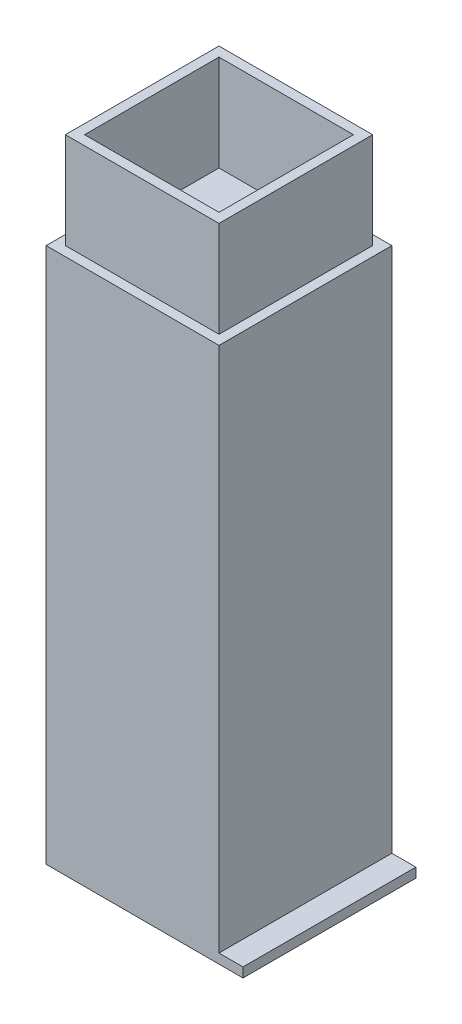
ISO-10303-21;
HEADER;
FILE_DESCRIPTION(('STEP AP214'),'2;1');
FILE_NAME('part.step','',(''),(''),'','','');
FILE_SCHEMA(('AUTOMOTIVE_DESIGN { 1 0 10303 214 1 1 1 1 }'));
ENDSEC;
DATA;
#1=APPLICATION_CONTEXT('core data for automotive mechanical design processes');
#2=APPLICATION_PROTOCOL_DEFINITION('international standard','automotive_design',2000,#1);
#3=PRODUCT_CONTEXT('',#1,'mechanical');
#4=PRODUCT('Part','Part','',(#3));
#5=PRODUCT_RELATED_PRODUCT_CATEGORY('part','',(#4));
#6=PRODUCT_DEFINITION_FORMATION('','',#4);
#7=PRODUCT_DEFINITION_CONTEXT('part definition',#1,'design');
#8=PRODUCT_DEFINITION('design','',#6,#7);
#9=PRODUCT_DEFINITION_SHAPE('','',#8);
#10=(LENGTH_UNIT() NAMED_UNIT(*) SI_UNIT(.MILLI.,.METRE.));
#11=(NAMED_UNIT(*) PLANE_ANGLE_UNIT() SI_UNIT($,.RADIAN.));
#12=(NAMED_UNIT(*) SI_UNIT($,.STERADIAN.) SOLID_ANGLE_UNIT());
#13=UNCERTAINTY_MEASURE_WITH_UNIT(LENGTH_MEASURE(1.E-05),#10,'distance_accuracy_value','');
#14=(GEOMETRIC_REPRESENTATION_CONTEXT(3) GLOBAL_UNCERTAINTY_ASSIGNED_CONTEXT((#13)) GLOBAL_UNIT_ASSIGNED_CONTEXT((#10,
#11,#12)) REPRESENTATION_CONTEXT('',''));
#15=CARTESIAN_POINT('',(0.,0.,0.));
#16=DIRECTION('',(0.,0.,1.));
#17=DIRECTION('',(1.,0.,0.));
#18=AXIS2_PLACEMENT_3D('',#15,#16,#17);
#19=CARTESIAN_POINT('',(0.,81.2,0.));
#20=DIRECTION('',(0.,1.,0.));
#21=DIRECTION('',(0.,0.,1.));
#22=AXIS2_PLACEMENT_3D('',#19,#20,#21);
#23=PLANE('',#22);
#24=DIRECTION('',(0.,0.,1.));
#25=VECTOR('',#24,1.);
#26=CARTESIAN_POINT('',(-79.0444738201403,81.2,-50.0092772389049));
#27=LINE('',#26,#25);
#28=CARTESIAN_POINT('',(-79.0444738201403,81.2,-50.0092772389049));
#29=VERTEX_POINT('',#28);
#30=CARTESIAN_POINT('',(-79.0444738201403,81.2,-14.0092772389049));
#31=VERTEX_POINT('',#30);
#32=EDGE_CURVE('E221',#29,#31,#27,.T.);
#33=ORIENTED_EDGE('',*,*,#32,.T.);
#34=DIRECTION('',(1.,0.,0.));
#35=VECTOR('',#34,1.);
#36=CARTESIAN_POINT('',(-79.0444738201403,81.2,-14.0092772389049));
#37=LINE('',#36,#35);
#38=CARTESIAN_POINT('',(-43.0444738201402,81.2,-14.0092772389049));
#39=VERTEX_POINT('',#38);
#40=EDGE_CURVE('E224',#31,#39,#37,.T.);
#41=ORIENTED_EDGE('',*,*,#40,.T.);
#42=DIRECTION('',(0.,0.,-1.));
#43=VECTOR('',#42,1.);
#44=CARTESIAN_POINT('',(-43.0444738201402,81.2,-50.0092772389049));
#45=LINE('',#44,#43);
#46=CARTESIAN_POINT('',(-43.0444738201402,81.2,-50.0092772389049));
#47=VERTEX_POINT('',#46);
#48=EDGE_CURVE('E228',#39,#47,#45,.T.);
#49=ORIENTED_EDGE('',*,*,#48,.T.);
#50=DIRECTION('',(-1.,0.,0.));
#51=VECTOR('',#50,1.);
#52=CARTESIAN_POINT('',(-79.0444738201403,81.2,-50.0092772389049));
#53=LINE('',#52,#51);
#54=EDGE_CURVE('E231',#47,#29,#53,.T.);
#55=ORIENTED_EDGE('',*,*,#54,.T.);
#56=EDGE_LOOP('',(#33,#41,#49,#55));
#57=FACE_BOUND('',#56,.T.);
#58=DIRECTION('',(0.,0.,-1.));
#59=VECTOR('',#58,1.);
#60=CARTESIAN_POINT('',(-45.0444738201402,81.2,0.));
#61=LINE('',#60,#59);
#62=CARTESIAN_POINT('',(-45.0444738201402,81.2,-16.0092772389049));
#63=VERTEX_POINT('',#62);
#64=CARTESIAN_POINT('',(-45.0444738201402,81.2,-48.0092772389049));
#65=VERTEX_POINT('',#64);
#66=EDGE_CURVE('E56',#63,#65,#61,.T.);
#67=ORIENTED_EDGE('',*,*,#66,.F.);
#68=DIRECTION('',(1.,0.,0.));
#69=VECTOR('',#68,1.);
#70=CARTESIAN_POINT('',(0.,81.2,-16.0092772389049));
#71=LINE('',#70,#69);
#72=CARTESIAN_POINT('',(-77.0444738201403,81.2,-16.0092772389049));
#73=VERTEX_POINT('',#72);
#74=EDGE_CURVE('E211',#73,#63,#71,.T.);
#75=ORIENTED_EDGE('',*,*,#74,.F.);
#76=DIRECTION('',(0.,0.,-1.));
#77=VECTOR('',#76,1.);
#78=CARTESIAN_POINT('',(-77.0444738201403,81.2,0.));
#79=LINE('',#78,#77);
#80=CARTESIAN_POINT('',(-77.0444738201403,81.2,-48.0092772389049));
#81=VERTEX_POINT('',#80);
#82=EDGE_CURVE('E397',#73,#81,#79,.T.);
#83=ORIENTED_EDGE('',*,*,#82,.T.);
#84=DIRECTION('',(1.,0.,0.));
#85=VECTOR('',#84,1.);
#86=CARTESIAN_POINT('',(0.,81.2,-48.0092772389049));
#87=LINE('',#86,#85);
#88=EDGE_CURVE('E61',#81,#65,#87,.T.);
#89=ORIENTED_EDGE('',*,*,#88,.T.);
#90=EDGE_LOOP('',(#67,#75,#83,#89));
#91=FACE_BOUND('',#90,.T.);
#92=ADVANCED_FACE('F40',(#57,#91),#23,.T.);
#93=CARTESIAN_POINT('',(-43.0444738201403,76.2,-50.0092772389049));
#94=DIRECTION('',(-1.,0.,0.));
#95=DIRECTION('',(0.,0.,1.));
#96=AXIS2_PLACEMENT_3D('',#93,#94,#95);
#97=PLANE('',#96);
#98=DIRECTION('',(0.,0.,1.));
#99=VECTOR('',#98,1.);
#100=CARTESIAN_POINT('',(-43.0444738201402,-28.4,-14.0092772389049));
#101=LINE('',#100,#99);
#102=CARTESIAN_POINT('',(-43.0444738201403,-28.4,-50.0092772389049));
#103=VERTEX_POINT('',#102);
#104=CARTESIAN_POINT('',(-43.0444738201402,-28.4,-14.0092772389049));
#105=VERTEX_POINT('',#104);
#106=EDGE_CURVE('E234',#103,#105,#101,.T.);
#107=ORIENTED_EDGE('',*,*,#106,.F.);
#108=DIRECTION('',(0.,-1.,0.));
#109=VECTOR('',#108,1.);
#110=CARTESIAN_POINT('',(-43.0444738201403,76.2,-50.0092772389049));
#111=LINE('',#110,#109);
#112=EDGE_CURVE('E326',#47,#103,#111,.T.);
#113=ORIENTED_EDGE('',*,*,#112,.F.);
#114=ORIENTED_EDGE('',*,*,#48,.F.);
#115=DIRECTION('',(0.,-1.,0.));
#116=VECTOR('',#115,1.);
#117=CARTESIAN_POINT('',(-43.0444738201402,76.2,-14.0092772389049));
#118=LINE('',#117,#116);
#119=EDGE_CURVE('E49',#39,#105,#118,.T.);
#120=ORIENTED_EDGE('',*,*,#119,.T.);
#121=EDGE_LOOP('',(#107,#113,#114,#120));
#122=FACE_BOUND('',#121,.T.);
#123=ADVANCED_FACE('F330',(#122),#97,.F.);
#124=CARTESIAN_POINT('',(-79.0444738201403,76.2,-50.0092772389049));
#125=DIRECTION('',(1.,0.,0.));
#126=DIRECTION('',(0.,0.,-1.));
#127=AXIS2_PLACEMENT_3D('',#124,#125,#126);
#128=PLANE('',#127);
#129=DIRECTION('',(0.,-1.,0.));
#130=VECTOR('',#129,1.);
#131=CARTESIAN_POINT('',(-79.0444738201403,76.2,-50.0092772389049));
#132=LINE('',#131,#130);
#133=CARTESIAN_POINT('',(-79.0444738201403,-30.4,-50.0092772389049));
#134=VERTEX_POINT('',#133);
#135=EDGE_CURVE('E324',#29,#134,#132,.T.);
#136=ORIENTED_EDGE('',*,*,#135,.T.);
#137=DIRECTION('',(0.,0.,-1.));
#138=VECTOR('',#137,1.);
#139=CARTESIAN_POINT('',(-79.0444738201403,-30.4,-14.0092772389049));
#140=LINE('',#139,#138);
#141=CARTESIAN_POINT('',(-79.0444738201403,-30.4,-14.0092772389049));
#142=VERTEX_POINT('',#141);
#143=EDGE_CURVE('E286',#142,#134,#140,.T.);
#144=ORIENTED_EDGE('',*,*,#143,.F.);
#145=DIRECTION('',(0.,-1.,0.));
#146=VECTOR('',#145,1.);
#147=CARTESIAN_POINT('',(-79.0444738201403,76.2,-14.0092772389049));
#148=LINE('',#147,#146);
#149=EDGE_CURVE('E11',#31,#142,#148,.T.);
#150=ORIENTED_EDGE('',*,*,#149,.F.);
#151=ORIENTED_EDGE('',*,*,#32,.F.);
#152=EDGE_LOOP('',(#136,#144,#150,#151));
#153=FACE_BOUND('',#152,.T.);
#154=ADVANCED_FACE('F42',(#153),#128,.F.);
#155=CARTESIAN_POINT('',(-79.0444738201403,76.2,-14.0092772389049));
#156=DIRECTION('',(0.,0.,-1.));
#157=DIRECTION('',(-1.,0.,0.));
#158=AXIS2_PLACEMENT_3D('',#155,#156,#157);
#159=PLANE('',#158);
#160=ORIENTED_EDGE('',*,*,#149,.T.);
#161=DIRECTION('',(-1.,0.,0.));
#162=VECTOR('',#161,1.);
#163=CARTESIAN_POINT('',(-43.0444738201402,-30.4,-14.0092772389049));
#164=LINE('',#163,#162);
#165=CARTESIAN_POINT('',(-38.0444738201402,-30.4,-14.0092772389049));
#166=VERTEX_POINT('',#165);
#167=EDGE_CURVE('E283',#166,#142,#164,.T.);
#168=ORIENTED_EDGE('',*,*,#167,.F.);
#169=DIRECTION('',(0.,-1.,0.));
#170=VECTOR('',#169,1.);
#171=CARTESIAN_POINT('',(-38.0444738201402,-28.4,-14.0092772389049));
#172=LINE('',#171,#170);
#173=CARTESIAN_POINT('',(-38.0444738201402,-28.4,-14.0092772389049));
#174=VERTEX_POINT('',#173);
#175=EDGE_CURVE('E235',#174,#166,#172,.T.);
#176=ORIENTED_EDGE('',*,*,#175,.F.);
#177=DIRECTION('',(-1.,0.,0.));
#178=VECTOR('',#177,1.);
#179=CARTESIAN_POINT('',(-38.0444738201402,-28.4,-14.0092772389049));
#180=LINE('',#179,#178);
#181=EDGE_CURVE('E245',#174,#105,#180,.T.);
#182=ORIENTED_EDGE('',*,*,#181,.T.);
#183=ORIENTED_EDGE('',*,*,#119,.F.);
#184=ORIENTED_EDGE('',*,*,#40,.F.);
#185=EDGE_LOOP('',(#160,#168,#176,#182,#183,#184));
#186=FACE_BOUND('',#185,.T.);
#187=ADVANCED_FACE('F339',(#186),#159,.F.);
#188=CARTESIAN_POINT('',(-79.0444738201403,76.2,-50.0092772389049));
#189=DIRECTION('',(0.,0.,1.));
#190=DIRECTION('',(1.,0.,0.));
#191=AXIS2_PLACEMENT_3D('',#188,#189,#190);
#192=PLANE('',#191);
#193=ORIENTED_EDGE('',*,*,#112,.T.);
#194=DIRECTION('',(-1.,0.,0.));
#195=VECTOR('',#194,1.);
#196=CARTESIAN_POINT('',(-38.0444738201403,-28.4,-50.0092772389049));
#197=LINE('',#196,#195);
#198=CARTESIAN_POINT('',(-38.0444738201403,-28.4,-50.0092772389049));
#199=VERTEX_POINT('',#198);
#200=EDGE_CURVE('E250',#199,#103,#197,.T.);
#201=ORIENTED_EDGE('',*,*,#200,.F.);
#202=DIRECTION('',(0.,1.,0.));
#203=VECTOR('',#202,1.);
#204=CARTESIAN_POINT('',(-38.0444738201403,-28.4,-50.0092772389049));
#205=LINE('',#204,#203);
#206=CARTESIAN_POINT('',(-38.0444738201403,-30.4,-50.0092772389049));
#207=VERTEX_POINT('',#206);
#208=EDGE_CURVE('E241',#207,#199,#205,.T.);
#209=ORIENTED_EDGE('',*,*,#208,.F.);
#210=DIRECTION('',(1.,0.,0.));
#211=VECTOR('',#210,1.);
#212=CARTESIAN_POINT('',(-43.0444738201402,-30.4,-50.0092772389049));
#213=LINE('',#212,#211);
#214=EDGE_CURVE('E289',#134,#207,#213,.T.);
#215=ORIENTED_EDGE('',*,*,#214,.F.);
#216=ORIENTED_EDGE('',*,*,#135,.F.);
#217=ORIENTED_EDGE('',*,*,#54,.F.);
#218=EDGE_LOOP('',(#193,#201,#209,#215,#216,#217));
#219=FACE_BOUND('',#218,.T.);
#220=ADVANCED_FACE('F346',(#219),#192,.F.);
#221=CARTESIAN_POINT('',(0.,-30.4,0.));
#222=DIRECTION('',(0.,1.,0.));
#223=DIRECTION('',(0.,0.,1.));
#224=AXIS2_PLACEMENT_3D('',#221,#222,#223);
#225=PLANE('',#224);
#226=ORIENTED_EDGE('',*,*,#214,.T.);
#227=DIRECTION('',(0.,0.,-1.));
#228=VECTOR('',#227,1.);
#229=CARTESIAN_POINT('',(-38.0444738201402,-30.4,-14.0092772389049));
#230=LINE('',#229,#228);
#231=EDGE_CURVE('E238',#166,#207,#230,.T.);
#232=ORIENTED_EDGE('',*,*,#231,.F.);
#233=ORIENTED_EDGE('',*,*,#167,.T.);
#234=ORIENTED_EDGE('',*,*,#143,.T.);
#235=EDGE_LOOP('',(#226,#232,#233,#234));
#236=FACE_BOUND('',#235,.T.);
#237=DIRECTION('',(0.,0.,-1.));
#238=VECTOR('',#237,1.);
#239=CARTESIAN_POINT('',(-77.0444738201403,-30.4,-16.0092772389049));
#240=LINE('',#239,#238);
#241=CARTESIAN_POINT('',(-77.0444738201403,-30.4,-16.0092772389049));
#242=VERTEX_POINT('',#241);
#243=CARTESIAN_POINT('',(-77.0444738201403,-30.4,-48.0092772389049));
#244=VERTEX_POINT('',#243);
#245=EDGE_CURVE('E254',#242,#244,#240,.T.);
#246=ORIENTED_EDGE('',*,*,#245,.F.);
#247=DIRECTION('',(-1.,0.,0.));
#248=VECTOR('',#247,1.);
#249=CARTESIAN_POINT('',(-77.0444738201403,-30.4,-16.0092772389049));
#250=LINE('',#249,#248);
#251=CARTESIAN_POINT('',(-45.0444738201402,-30.4,-16.0092772389049));
#252=VERTEX_POINT('',#251);
#253=EDGE_CURVE('E262',#252,#242,#250,.T.);
#254=ORIENTED_EDGE('',*,*,#253,.F.);
#255=DIRECTION('',(0.,0.,1.));
#256=VECTOR('',#255,1.);
#257=CARTESIAN_POINT('',(-45.0444738201402,-30.4,-16.0092772389049));
#258=LINE('',#257,#256);
#259=CARTESIAN_POINT('',(-45.0444738201402,-30.4,-48.0092772389049));
#260=VERTEX_POINT('',#259);
#261=EDGE_CURVE('E259',#260,#252,#258,.T.);
#262=ORIENTED_EDGE('',*,*,#261,.F.);
#263=DIRECTION('',(1.,0.,0.));
#264=VECTOR('',#263,1.);
#265=CARTESIAN_POINT('',(-77.0444738201403,-30.4,-48.0092772389049));
#266=LINE('',#265,#264);
#267=EDGE_CURVE('E256',#244,#260,#266,.T.);
#268=ORIENTED_EDGE('',*,*,#267,.F.);
#269=EDGE_LOOP('',(#246,#254,#262,#268));
#270=FACE_BOUND('',#269,.T.);
#271=ADVANCED_FACE('F353',(#236,#270),#225,.F.);
#272=CARTESIAN_POINT('',(-77.0444738201403,-30.4,-16.0092772389049));
#273=DIRECTION('',(1.,0.,0.));
#274=DIRECTION('',(0.,0.,-1.));
#275=AXIS2_PLACEMENT_3D('',#272,#273,#274);
#276=PLANE('',#275);
#277=DIRECTION('',(0.,0.,-1.));
#278=VECTOR('',#277,1.);
#279=CARTESIAN_POINT('',(-77.0444738201403,-5.,-16.0092772389049));
#280=LINE('',#279,#278);
#281=CARTESIAN_POINT('',(-77.0444738201403,-5.,-16.0092772389049));
#282=VERTEX_POINT('',#281);
#283=CARTESIAN_POINT('',(-77.0444738201403,-5.,-48.0092772389049));
#284=VERTEX_POINT('',#283);
#285=EDGE_CURVE('E253',#282,#284,#280,.T.);
#286=ORIENTED_EDGE('',*,*,#285,.F.);
#287=DIRECTION('',(0.,1.,0.));
#288=VECTOR('',#287,1.);
#289=CARTESIAN_POINT('',(-77.0444738201403,-30.4,-16.0092772389049));
#290=LINE('',#289,#288);
#291=EDGE_CURVE('E264',#242,#282,#290,.T.);
#292=ORIENTED_EDGE('',*,*,#291,.F.);
#293=ORIENTED_EDGE('',*,*,#245,.T.);
#294=DIRECTION('',(0.,1.,0.));
#295=VECTOR('',#294,1.);
#296=CARTESIAN_POINT('',(-77.0444738201403,-30.4,-48.0092772389049));
#297=LINE('',#296,#295);
#298=EDGE_CURVE('E280',#244,#284,#297,.T.);
#299=ORIENTED_EDGE('',*,*,#298,.T.);
#300=EDGE_LOOP('',(#286,#292,#293,#299));
#301=FACE_BOUND('',#300,.T.);
#302=ADVANCED_FACE('F558',(#301),#276,.T.);
#303=CARTESIAN_POINT('',(-77.0444738201403,-30.4,-48.0092772389049));
#304=DIRECTION('',(0.,0.,1.));
#305=DIRECTION('',(1.,0.,0.));
#306=AXIS2_PLACEMENT_3D('',#303,#304,#305);
#307=PLANE('',#306);
#308=DIRECTION('',(1.,0.,0.));
#309=VECTOR('',#308,1.);
#310=CARTESIAN_POINT('',(-77.0444738201403,-5.,-48.0092772389049));
#311=LINE('',#310,#309);
#312=CARTESIAN_POINT('',(-45.0444738201402,-5.,-48.0092772389049));
#313=VERTEX_POINT('',#312);
#314=EDGE_CURVE('E267',#284,#313,#311,.T.);
#315=ORIENTED_EDGE('',*,*,#314,.F.);
#316=ORIENTED_EDGE('',*,*,#298,.F.);
#317=ORIENTED_EDGE('',*,*,#267,.T.);
#318=DIRECTION('',(0.,1.,0.));
#319=VECTOR('',#318,1.);
#320=CARTESIAN_POINT('',(-45.0444738201402,-30.4,-48.0092772389049));
#321=LINE('',#320,#319);
#322=EDGE_CURVE('E278',#260,#313,#321,.T.);
#323=ORIENTED_EDGE('',*,*,#322,.T.);
#324=EDGE_LOOP('',(#315,#316,#317,#323));
#325=FACE_BOUND('',#324,.T.);
#326=ADVANCED_FACE('F550',(#325),#307,.T.);
#327=CARTESIAN_POINT('',(-45.0444738201402,-30.4,-16.0092772389049));
#328=DIRECTION('',(-1.,0.,0.));
#329=DIRECTION('',(0.,0.,1.));
#330=AXIS2_PLACEMENT_3D('',#327,#328,#329);
#331=PLANE('',#330);
#332=DIRECTION('',(0.,0.,1.));
#333=VECTOR('',#332,1.);
#334=CARTESIAN_POINT('',(-45.0444738201402,-5.,-16.0092772389049));
#335=LINE('',#334,#333);
#336=CARTESIAN_POINT('',(-45.0444738201402,-5.,-16.0092772389049));
#337=VERTEX_POINT('',#336);
#338=EDGE_CURVE('E270',#313,#337,#335,.T.);
#339=ORIENTED_EDGE('',*,*,#338,.F.);
#340=ORIENTED_EDGE('',*,*,#322,.F.);
#341=ORIENTED_EDGE('',*,*,#261,.T.);
#342=DIRECTION('',(0.,1.,0.));
#343=VECTOR('',#342,1.);
#344=CARTESIAN_POINT('',(-45.0444738201402,-30.4,-16.0092772389049));
#345=LINE('',#344,#343);
#346=EDGE_CURVE('E276',#252,#337,#345,.T.);
#347=ORIENTED_EDGE('',*,*,#346,.T.);
#348=EDGE_LOOP('',(#339,#340,#341,#347));
#349=FACE_BOUND('',#348,.T.);
#350=ADVANCED_FACE('F542',(#349),#331,.T.);
#351=CARTESIAN_POINT('',(-77.0444738201403,-30.4,-16.0092772389049));
#352=DIRECTION('',(0.,0.,-1.));
#353=DIRECTION('',(-1.,0.,0.));
#354=AXIS2_PLACEMENT_3D('',#351,#352,#353);
#355=PLANE('',#354);
#356=DIRECTION('',(-1.,0.,0.));
#357=VECTOR('',#356,1.);
#358=CARTESIAN_POINT('',(-77.0444738201403,-5.,-16.0092772389049));
#359=LINE('',#358,#357);
#360=EDGE_CURVE('E257',#337,#282,#359,.T.);
#361=ORIENTED_EDGE('',*,*,#360,.F.);
#362=ORIENTED_EDGE('',*,*,#346,.F.);
#363=ORIENTED_EDGE('',*,*,#253,.T.);
#364=ORIENTED_EDGE('',*,*,#291,.T.);
#365=EDGE_LOOP('',(#361,#362,#363,#364));
#366=FACE_BOUND('',#365,.T.);
#367=ADVANCED_FACE('F534',(#366),#355,.T.);
#368=CARTESIAN_POINT('',(0.,-5.,0.));
#369=DIRECTION('',(0.,1.,0.));
#370=DIRECTION('',(0.,0.,1.));
#371=AXIS2_PLACEMENT_3D('',#368,#369,#370);
#372=PLANE('',#371);
#373=ORIENTED_EDGE('',*,*,#360,.T.);
#374=ORIENTED_EDGE('',*,*,#285,.T.);
#375=ORIENTED_EDGE('',*,*,#314,.T.);
#376=ORIENTED_EDGE('',*,*,#338,.T.);
#377=EDGE_LOOP('',(#373,#374,#375,#376));
#378=FACE_BOUND('',#377,.T.);
#379=ADVANCED_FACE('F526',(#378),#372,.F.);
#380=CARTESIAN_POINT('',(-38.0444738201402,-28.4,-14.0092772389049));
#381=DIRECTION('',(0.,-1.,0.));
#382=DIRECTION('',(0.,0.,-1.));
#383=AXIS2_PLACEMENT_3D('',#380,#381,#382);
#384=PLANE('',#383);
#385=ORIENTED_EDGE('',*,*,#106,.T.);
#386=ORIENTED_EDGE('',*,*,#181,.F.);
#387=DIRECTION('',(0.,0.,1.));
#388=VECTOR('',#387,1.);
#389=CARTESIAN_POINT('',(-38.0444738201402,-28.4,-14.0092772389049));
#390=LINE('',#389,#388);
#391=EDGE_CURVE('E243',#199,#174,#390,.T.);
#392=ORIENTED_EDGE('',*,*,#391,.F.);
#393=ORIENTED_EDGE('',*,*,#200,.T.);
#394=EDGE_LOOP('',(#385,#386,#392,#393));
#395=FACE_BOUND('',#394,.T.);
#396=ADVANCED_FACE('F335',(#395),#384,.F.);
#397=CARTESIAN_POINT('',(-38.0444738201402,0.,0.));
#398=DIRECTION('',(1.,0.,0.));
#399=DIRECTION('',(0.,0.,-1.));
#400=AXIS2_PLACEMENT_3D('',#397,#398,#399);
#401=PLANE('',#400);
#402=ORIENTED_EDGE('',*,*,#175,.T.);
#403=ORIENTED_EDGE('',*,*,#231,.T.);
#404=ORIENTED_EDGE('',*,*,#208,.T.);
#405=ORIENTED_EDGE('',*,*,#391,.T.);
#406=EDGE_LOOP('',(#402,#403,#404,#405));
#407=FACE_BOUND('',#406,.T.);
#408=ADVANCED_FACE('F342',(#407),#401,.T.);
#409=CARTESIAN_POINT('',(0.,101.2,-46.0092772389049));
#410=DIRECTION('',(0.,0.,-1.));
#411=DIRECTION('',(-1.,0.,0.));
#412=AXIS2_PLACEMENT_3D('',#409,#410,#411);
#413=PLANE('',#412);
#414=DIRECTION('',(1.,0.,0.));
#415=VECTOR('',#414,1.);
#416=CARTESIAN_POINT('',(0.,81.2,-46.0092772389049));
#417=LINE('',#416,#415);
#418=CARTESIAN_POINT('',(-75.0444738201403,81.2,-46.0092772389049));
#419=VERTEX_POINT('',#418);
#420=CARTESIAN_POINT('',(-47.0444738201402,81.2,-46.0092772389049));
#421=VERTEX_POINT('',#420);
#422=EDGE_CURVE('E380',#419,#421,#417,.T.);
#423=ORIENTED_EDGE('',*,*,#422,.T.);
#424=DIRECTION('',(0.,-1.,0.));
#425=VECTOR('',#424,1.);
#426=CARTESIAN_POINT('',(-47.0444738201402,101.2,-46.0092772389049));
#427=LINE('',#426,#425);
#428=CARTESIAN_POINT('',(-47.0444738201402,101.2,-46.0092772389049));
#429=VERTEX_POINT('',#428);
#430=EDGE_CURVE('E225',#429,#421,#427,.T.);
#431=ORIENTED_EDGE('',*,*,#430,.F.);
#432=DIRECTION('',(1.,0.,0.));
#433=VECTOR('',#432,1.);
#434=CARTESIAN_POINT('',(0.,101.2,-46.0092772389049));
#435=LINE('',#434,#433);
#436=CARTESIAN_POINT('',(-75.0444738201403,101.2,-46.0092772389049));
#437=VERTEX_POINT('',#436);
#438=EDGE_CURVE('E424',#437,#429,#435,.T.);
#439=ORIENTED_EDGE('',*,*,#438,.F.);
#440=DIRECTION('',(0.,-1.,0.));
#441=VECTOR('',#440,1.);
#442=CARTESIAN_POINT('',(-75.0444738201403,101.2,-46.0092772389049));
#443=LINE('',#442,#441);
#444=EDGE_CURVE('E212',#437,#419,#443,.T.);
#445=ORIENTED_EDGE('',*,*,#444,.T.);
#446=EDGE_LOOP('',(#423,#431,#439,#445));
#447=FACE_BOUND('',#446,.T.);
#448=ADVANCED_FACE('F395',(#447),#413,.F.);
#449=CARTESIAN_POINT('',(-47.0444738201402,101.2,0.));
#450=DIRECTION('',(1.,0.,0.));
#451=DIRECTION('',(0.,0.,-1.));
#452=AXIS2_PLACEMENT_3D('',#449,#450,#451);
#453=PLANE('',#452);
#454=DIRECTION('',(0.,0.,1.));
#455=VECTOR('',#454,1.);
#456=CARTESIAN_POINT('',(-47.0444738201402,81.2,0.));
#457=LINE('',#456,#455);
#458=CARTESIAN_POINT('',(-47.0444738201402,81.2,-18.0092772389049));
#459=VERTEX_POINT('',#458);
#460=EDGE_CURVE('E377',#421,#459,#457,.T.);
#461=ORIENTED_EDGE('',*,*,#460,.T.);
#462=DIRECTION('',(0.,-1.,0.));
#463=VECTOR('',#462,1.);
#464=CARTESIAN_POINT('',(-47.0444738201402,101.2,-18.0092772389049));
#465=LINE('',#464,#463);
#466=CARTESIAN_POINT('',(-47.0444738201402,101.2,-18.0092772389049));
#467=VERTEX_POINT('',#466);
#468=EDGE_CURVE('E393',#467,#459,#465,.T.);
#469=ORIENTED_EDGE('',*,*,#468,.F.);
#470=DIRECTION('',(0.,0.,1.));
#471=VECTOR('',#470,1.);
#472=CARTESIAN_POINT('',(-47.0444738201402,101.2,0.));
#473=LINE('',#472,#471);
#474=EDGE_CURVE('E389',#429,#467,#473,.T.);
#475=ORIENTED_EDGE('',*,*,#474,.F.);
#476=ORIENTED_EDGE('',*,*,#430,.T.);
#477=EDGE_LOOP('',(#461,#469,#475,#476));
#478=FACE_BOUND('',#477,.T.);
#479=ADVANCED_FACE('F388',(#478),#453,.F.);
#480=CARTESIAN_POINT('',(0.,101.2,-18.0092772389049));
#481=DIRECTION('',(0.,0.,-1.));
#482=DIRECTION('',(-1.,0.,0.));
#483=AXIS2_PLACEMENT_3D('',#480,#481,#482);
#484=PLANE('',#483);
#485=DIRECTION('',(1.,0.,0.));
#486=VECTOR('',#485,1.);
#487=CARTESIAN_POINT('',(0.,81.2,-18.0092772389049));
#488=LINE('',#487,#486);
#489=CARTESIAN_POINT('',(-75.0444738201403,81.2,-18.0092772389049));
#490=VERTEX_POINT('',#489);
#491=EDGE_CURVE('E382',#490,#459,#488,.T.);
#492=ORIENTED_EDGE('',*,*,#491,.F.);
#493=DIRECTION('',(0.,-1.,0.));
#494=VECTOR('',#493,1.);
#495=CARTESIAN_POINT('',(-75.0444738201403,101.2,-18.0092772389049));
#496=LINE('',#495,#494);
#497=CARTESIAN_POINT('',(-75.0444738201403,101.2,-18.0092772389049));
#498=VERTEX_POINT('',#497);
#499=EDGE_CURVE('E215',#498,#490,#496,.T.);
#500=ORIENTED_EDGE('',*,*,#499,.F.);
#501=DIRECTION('',(1.,0.,0.));
#502=VECTOR('',#501,1.);
#503=CARTESIAN_POINT('',(0.,101.2,-18.0092772389049));
#504=LINE('',#503,#502);
#505=EDGE_CURVE('E420',#498,#467,#504,.T.);
#506=ORIENTED_EDGE('',*,*,#505,.T.);
#507=ORIENTED_EDGE('',*,*,#468,.T.);
#508=EDGE_LOOP('',(#492,#500,#506,#507));
#509=FACE_BOUND('',#508,.T.);
#510=ADVANCED_FACE('F431',(#509),#484,.T.);
#511=CARTESIAN_POINT('',(0.,101.2,-16.0092772389049));
#512=DIRECTION('',(0.,0.,-1.));
#513=DIRECTION('',(-1.,0.,0.));
#514=AXIS2_PLACEMENT_3D('',#511,#512,#513);
#515=PLANE('',#514);
#516=ORIENTED_EDGE('',*,*,#74,.T.);
#517=DIRECTION('',(0.,-1.,0.));
#518=VECTOR('',#517,1.);
#519=CARTESIAN_POINT('',(-45.0444738201402,101.2,-16.0092772389049));
#520=LINE('',#519,#518);
#521=CARTESIAN_POINT('',(-45.0444738201402,101.2,-16.0092772389049));
#522=VERTEX_POINT('',#521);
#523=EDGE_CURVE('E191',#522,#63,#520,.T.);
#524=ORIENTED_EDGE('',*,*,#523,.F.);
#525=DIRECTION('',(1.,0.,0.));
#526=VECTOR('',#525,1.);
#527=CARTESIAN_POINT('',(0.,101.2,-16.0092772389049));
#528=LINE('',#527,#526);
#529=CARTESIAN_POINT('',(-77.0444738201403,101.2,-16.0092772389049));
#530=VERTEX_POINT('',#529);
#531=EDGE_CURVE('E198',#530,#522,#528,.T.);
#532=ORIENTED_EDGE('',*,*,#531,.F.);
#533=DIRECTION('',(0.,-1.,0.));
#534=VECTOR('',#533,1.);
#535=CARTESIAN_POINT('',(-77.0444738201403,101.2,-16.0092772389049));
#536=LINE('',#535,#534);
#537=EDGE_CURVE('E407',#530,#73,#536,.T.);
#538=ORIENTED_EDGE('',*,*,#537,.T.);
#539=EDGE_LOOP('',(#516,#524,#532,#538));
#540=FACE_BOUND('',#539,.T.);
#541=ADVANCED_FACE('F210',(#540),#515,.F.);
#542=CARTESIAN_POINT('',(-45.0444738201402,101.2,0.));
#543=DIRECTION('',(-1.,0.,0.));
#544=DIRECTION('',(0.,0.,1.));
#545=AXIS2_PLACEMENT_3D('',#542,#543,#544);
#546=PLANE('',#545);
#547=ORIENTED_EDGE('',*,*,#66,.T.);
#548=DIRECTION('',(0.,-1.,0.));
#549=VECTOR('',#548,1.);
#550=CARTESIAN_POINT('',(-45.0444738201402,101.2,-48.0092772389049));
#551=LINE('',#550,#549);
#552=CARTESIAN_POINT('',(-45.0444738201402,101.2,-48.0092772389049));
#553=VERTEX_POINT('',#552);
#554=EDGE_CURVE('E193',#553,#65,#551,.T.);
#555=ORIENTED_EDGE('',*,*,#554,.F.);
#556=DIRECTION('',(0.,0.,-1.));
#557=VECTOR('',#556,1.);
#558=CARTESIAN_POINT('',(-45.0444738201402,101.2,0.));
#559=LINE('',#558,#557);
#560=EDGE_CURVE('E187',#522,#553,#559,.T.);
#561=ORIENTED_EDGE('',*,*,#560,.F.);
#562=ORIENTED_EDGE('',*,*,#523,.T.);
#563=EDGE_LOOP('',(#547,#555,#561,#562));
#564=FACE_BOUND('',#563,.T.);
#565=ADVANCED_FACE('F189',(#564),#546,.F.);
#566=CARTESIAN_POINT('',(0.,101.2,-48.0092772389049));
#567=DIRECTION('',(0.,0.,-1.));
#568=DIRECTION('',(-1.,0.,0.));
#569=AXIS2_PLACEMENT_3D('',#566,#567,#568);
#570=PLANE('',#569);
#571=ORIENTED_EDGE('',*,*,#88,.F.);
#572=DIRECTION('',(0.,-1.,0.));
#573=VECTOR('',#572,1.);
#574=CARTESIAN_POINT('',(-77.0444738201403,101.2,-48.0092772389049));
#575=LINE('',#574,#573);
#576=CARTESIAN_POINT('',(-77.0444738201403,101.2,-48.0092772389049));
#577=VERTEX_POINT('',#576);
#578=EDGE_CURVE('E217',#577,#81,#575,.T.);
#579=ORIENTED_EDGE('',*,*,#578,.F.);
#580=DIRECTION('',(1.,0.,0.));
#581=VECTOR('',#580,1.);
#582=CARTESIAN_POINT('',(0.,101.2,-48.0092772389049));
#583=LINE('',#582,#581);
#584=EDGE_CURVE('E197',#577,#553,#583,.T.);
#585=ORIENTED_EDGE('',*,*,#584,.T.);
#586=ORIENTED_EDGE('',*,*,#554,.T.);
#587=EDGE_LOOP('',(#571,#579,#585,#586));
#588=FACE_BOUND('',#587,.T.);
#589=ADVANCED_FACE('F414',(#588),#570,.T.);
#590=CARTESIAN_POINT('',(-77.0444738201403,101.2,0.));
#591=DIRECTION('',(-1.,0.,0.));
#592=DIRECTION('',(0.,0.,1.));
#593=AXIS2_PLACEMENT_3D('',#590,#591,#592);
#594=PLANE('',#593);
#595=ORIENTED_EDGE('',*,*,#82,.F.);
#596=ORIENTED_EDGE('',*,*,#537,.F.);
#597=DIRECTION('',(0.,0.,-1.));
#598=VECTOR('',#597,1.);
#599=CARTESIAN_POINT('',(-77.0444738201403,101.2,0.));
#600=LINE('',#599,#598);
#601=EDGE_CURVE('E205',#530,#577,#600,.T.);
#602=ORIENTED_EDGE('',*,*,#601,.T.);
#603=ORIENTED_EDGE('',*,*,#578,.T.);
#604=EDGE_LOOP('',(#595,#596,#602,#603));
#605=FACE_BOUND('',#604,.T.);
#606=ADVANCED_FACE('F412',(#605),#594,.T.);
#607=CARTESIAN_POINT('',(-75.0444738201403,101.2,0.));
#608=DIRECTION('',(1.,0.,0.));
#609=DIRECTION('',(0.,0.,-1.));
#610=AXIS2_PLACEMENT_3D('',#607,#608,#609);
#611=PLANE('',#610);
#612=DIRECTION('',(0.,0.,1.));
#613=VECTOR('',#612,1.);
#614=CARTESIAN_POINT('',(-75.0444738201403,81.2,0.));
#615=LINE('',#614,#613);
#616=EDGE_CURVE('E208',#419,#490,#615,.T.);
#617=ORIENTED_EDGE('',*,*,#616,.F.);
#618=ORIENTED_EDGE('',*,*,#444,.F.);
#619=DIRECTION('',(0.,0.,1.));
#620=VECTOR('',#619,1.);
#621=CARTESIAN_POINT('',(-75.0444738201403,101.2,0.));
#622=LINE('',#621,#620);
#623=EDGE_CURVE('E408',#437,#498,#622,.T.);
#624=ORIENTED_EDGE('',*,*,#623,.T.);
#625=ORIENTED_EDGE('',*,*,#499,.T.);
#626=EDGE_LOOP('',(#617,#618,#624,#625));
#627=FACE_BOUND('',#626,.T.);
#628=ADVANCED_FACE('F374',(#627),#611,.T.);
#629=CARTESIAN_POINT('',(0.,101.2,0.));
#630=DIRECTION('',(0.,1.,0.));
#631=DIRECTION('',(0.,0.,1.));
#632=AXIS2_PLACEMENT_3D('',#629,#630,#631);
#633=PLANE('',#632);
#634=ORIENTED_EDGE('',*,*,#531,.T.);
#635=ORIENTED_EDGE('',*,*,#560,.T.);
#636=ORIENTED_EDGE('',*,*,#584,.F.);
#637=ORIENTED_EDGE('',*,*,#601,.F.);
#638=EDGE_LOOP('',(#634,#635,#636,#637));
#639=FACE_BOUND('',#638,.T.);
#640=ORIENTED_EDGE('',*,*,#438,.T.);
#641=ORIENTED_EDGE('',*,*,#474,.T.);
#642=ORIENTED_EDGE('',*,*,#505,.F.);
#643=ORIENTED_EDGE('',*,*,#623,.F.);
#644=EDGE_LOOP('',(#640,#641,#642,#643));
#645=FACE_BOUND('',#644,.T.);
#646=ADVANCED_FACE('F202',(#639,#645),#633,.T.);
#647=ORIENTED_EDGE('',*,*,#460,.F.);
#648=ORIENTED_EDGE('',*,*,#422,.F.);
#649=ORIENTED_EDGE('',*,*,#616,.T.);
#650=ORIENTED_EDGE('',*,*,#491,.T.);
#651=EDGE_LOOP('',(#647,#648,#649,#650));
#652=FACE_BOUND('',#651,.T.);
#653=ADVANCED_FACE('F363',(#652),#23,.T.);
#654=CLOSED_SHELL('',(#92,#123,#154,#187,#220,#271,#302,#326,#350,#367,#379,#396,#408,#448,#479,
#510,#541,#565,#589,#606,#628,#646,#653));
#655=CARTESIAN_POINT('',(0.,0.,0.));
#656=DIRECTION('',(0.,1.,0.));
#657=DIRECTION('',(0.,0.,1.));
#658=AXIS2_PLACEMENT_3D('',#655,#656,#657);
#659=PLANE('',#658);
#660=DIRECTION('',(-1.,0.,0.));
#661=VECTOR('',#660,1.);
#662=CARTESIAN_POINT('',(-77.0444738201403,0.,-48.0092772389049));
#663=LINE('',#662,#661);
#664=CARTESIAN_POINT('',(-45.0444738201403,0.,-48.0092772389049));
#665=VERTEX_POINT('',#664);
#666=CARTESIAN_POINT('',(-77.0444738201403,0.,-48.0092772389049));
#667=VERTEX_POINT('',#666);
#668=EDGE_CURVE('E296',#665,#667,#663,.T.);
#669=ORIENTED_EDGE('',*,*,#668,.T.);
#670=DIRECTION('',(0.,0.,1.));
#671=VECTOR('',#670,1.);
#672=CARTESIAN_POINT('',(-77.0444738201403,0.,-48.0092772389049));
#673=LINE('',#672,#671);
#674=CARTESIAN_POINT('',(-77.0444738201403,0.,-16.0092772389049));
#675=VERTEX_POINT('',#674);
#676=EDGE_CURVE('E291',#667,#675,#673,.T.);
#677=ORIENTED_EDGE('',*,*,#676,.T.);
#678=DIRECTION('',(1.,0.,0.));
#679=VECTOR('',#678,1.);
#680=CARTESIAN_POINT('',(-77.0444738201403,0.,-16.0092772389049));
#681=LINE('',#680,#679);
#682=CARTESIAN_POINT('',(-45.0444738201403,0.,-16.0092772389049));
#683=VERTEX_POINT('',#682);
#684=EDGE_CURVE('E308',#675,#683,#681,.T.);
#685=ORIENTED_EDGE('',*,*,#684,.T.);
#686=DIRECTION('',(0.,0.,-1.));
#687=VECTOR('',#686,1.);
#688=CARTESIAN_POINT('',(-45.0444738201403,0.,-48.0092772389049));
#689=LINE('',#688,#687);
#690=EDGE_CURVE('E311',#683,#665,#689,.T.);
#691=ORIENTED_EDGE('',*,*,#690,.T.);
#692=EDGE_LOOP('',(#669,#677,#685,#691));
#693=FACE_BOUND('',#692,.T.);
#694=ADVANCED_FACE('F639',(#693),#659,.T.);
#695=CARTESIAN_POINT('',(-45.0444738201403,76.2,-48.0092772389049));
#696=DIRECTION('',(-1.,0.,0.));
#697=DIRECTION('',(0.,0.,1.));
#698=AXIS2_PLACEMENT_3D('',#695,#696,#697);
#699=PLANE('',#698);
#700=ORIENTED_EDGE('',*,*,#690,.F.);
#701=DIRECTION('',(0.,-1.,0.));
#702=VECTOR('',#701,1.);
#703=CARTESIAN_POINT('',(-45.0444738201403,76.2,-16.0092772389049));
#704=LINE('',#703,#702);
#705=CARTESIAN_POINT('',(-45.0444738201403,76.2,-16.0092772389049));
#706=VERTEX_POINT('',#705);
#707=EDGE_CURVE('E319',#706,#683,#704,.T.);
#708=ORIENTED_EDGE('',*,*,#707,.F.);
#709=DIRECTION('',(0.,0.,-1.));
#710=VECTOR('',#709,1.);
#711=CARTESIAN_POINT('',(-45.0444738201403,76.2,-48.0092772389049));
#712=LINE('',#711,#710);
#713=CARTESIAN_POINT('',(-45.0444738201403,76.2,-48.0092772389049));
#714=VERTEX_POINT('',#713);
#715=EDGE_CURVE('E299',#706,#714,#712,.T.);
#716=ORIENTED_EDGE('',*,*,#715,.T.);
#717=DIRECTION('',(0.,-1.,0.));
#718=VECTOR('',#717,1.);
#719=CARTESIAN_POINT('',(-45.0444738201403,76.2,-48.0092772389049));
#720=LINE('',#719,#718);
#721=EDGE_CURVE('E317',#714,#665,#720,.T.);
#722=ORIENTED_EDGE('',*,*,#721,.T.);
#723=EDGE_LOOP('',(#700,#708,#716,#722));
#724=FACE_BOUND('',#723,.T.);
#725=ADVANCED_FACE('F642',(#724),#699,.T.);
#726=CARTESIAN_POINT('',(-77.0444738201403,76.2,-48.0092772389049));
#727=DIRECTION('',(0.,0.,1.));
#728=DIRECTION('',(1.,0.,0.));
#729=AXIS2_PLACEMENT_3D('',#726,#727,#728);
#730=PLANE('',#729);
#731=ORIENTED_EDGE('',*,*,#668,.F.);
#732=ORIENTED_EDGE('',*,*,#721,.F.);
#733=DIRECTION('',(-1.,0.,0.));
#734=VECTOR('',#733,1.);
#735=CARTESIAN_POINT('',(-77.0444738201403,76.2,-48.0092772389049));
#736=LINE('',#735,#734);
#737=CARTESIAN_POINT('',(-77.0444738201403,76.2,-48.0092772389049));
#738=VERTEX_POINT('',#737);
#739=EDGE_CURVE('E302',#714,#738,#736,.T.);
#740=ORIENTED_EDGE('',*,*,#739,.T.);
#741=DIRECTION('',(0.,-1.,0.));
#742=VECTOR('',#741,1.);
#743=CARTESIAN_POINT('',(-77.0444738201403,76.2,-48.0092772389049));
#744=LINE('',#743,#742);
#745=EDGE_CURVE('E305',#738,#667,#744,.T.);
#746=ORIENTED_EDGE('',*,*,#745,.T.);
#747=EDGE_LOOP('',(#731,#732,#740,#746));
#748=FACE_BOUND('',#747,.T.);
#749=ADVANCED_FACE('F662',(#748),#730,.T.);
#750=CARTESIAN_POINT('',(-77.0444738201403,76.2,-48.0092772389049));
#751=DIRECTION('',(1.,0.,0.));
#752=DIRECTION('',(0.,0.,-1.));
#753=AXIS2_PLACEMENT_3D('',#750,#751,#752);
#754=PLANE('',#753);
#755=ORIENTED_EDGE('',*,*,#676,.F.);
#756=ORIENTED_EDGE('',*,*,#745,.F.);
#757=DIRECTION('',(0.,0.,1.));
#758=VECTOR('',#757,1.);
#759=CARTESIAN_POINT('',(-77.0444738201403,76.2,-48.0092772389049));
#760=LINE('',#759,#758);
#761=CARTESIAN_POINT('',(-77.0444738201403,76.2,-16.0092772389049));
#762=VERTEX_POINT('',#761);
#763=EDGE_CURVE('E292',#738,#762,#760,.T.);
#764=ORIENTED_EDGE('',*,*,#763,.T.);
#765=DIRECTION('',(0.,-1.,0.));
#766=VECTOR('',#765,1.);
#767=CARTESIAN_POINT('',(-77.0444738201403,76.2,-16.0092772389049));
#768=LINE('',#767,#766);
#769=EDGE_CURVE('E321',#762,#675,#768,.T.);
#770=ORIENTED_EDGE('',*,*,#769,.T.);
#771=EDGE_LOOP('',(#755,#756,#764,#770));
#772=FACE_BOUND('',#771,.T.);
#773=ADVANCED_FACE('F655',(#772),#754,.T.);
#774=CARTESIAN_POINT('',(-77.0444738201403,76.2,-16.0092772389049));
#775=DIRECTION('',(0.,0.,-1.));
#776=DIRECTION('',(-1.,0.,0.));
#777=AXIS2_PLACEMENT_3D('',#774,#775,#776);
#778=PLANE('',#777);
#779=ORIENTED_EDGE('',*,*,#684,.F.);
#780=ORIENTED_EDGE('',*,*,#769,.F.);
#781=DIRECTION('',(1.,0.,0.));
#782=VECTOR('',#781,1.);
#783=CARTESIAN_POINT('',(-77.0444738201403,76.2,-16.0092772389049));
#784=LINE('',#783,#782);
#785=EDGE_CURVE('E295',#762,#706,#784,.T.);
#786=ORIENTED_EDGE('',*,*,#785,.T.);
#787=ORIENTED_EDGE('',*,*,#707,.T.);
#788=EDGE_LOOP('',(#779,#780,#786,#787));
#789=FACE_BOUND('',#788,.T.);
#790=ADVANCED_FACE('F661',(#789),#778,.T.);
#791=CARTESIAN_POINT('',(0.,76.2,0.));
#792=DIRECTION('',(0.,1.,0.));
#793=DIRECTION('',(0.,0.,1.));
#794=AXIS2_PLACEMENT_3D('',#791,#792,#793);
#795=PLANE('',#794);
#796=ORIENTED_EDGE('',*,*,#785,.F.);
#797=ORIENTED_EDGE('',*,*,#763,.F.);
#798=ORIENTED_EDGE('',*,*,#739,.F.);
#799=ORIENTED_EDGE('',*,*,#715,.F.);
#800=EDGE_LOOP('',(#796,#797,#798,#799));
#801=FACE_BOUND('',#800,.T.);
#802=ADVANCED_FACE('F479',(#801),#795,.F.);
#803=CLOSED_SHELL('',(#694,#725,#749,#773,#790,#802));
#804=ORIENTED_CLOSED_SHELL('',*,#803,.T.);
#805=BREP_WITH_VOIDS('B2',#654,(#804));
#806=ADVANCED_BREP_SHAPE_REPRESENTATION('',(#18,#805),#14);
#807=SHAPE_DEFINITION_REPRESENTATION(#9,#806);
ENDSEC;
END-ISO-10303-21;
